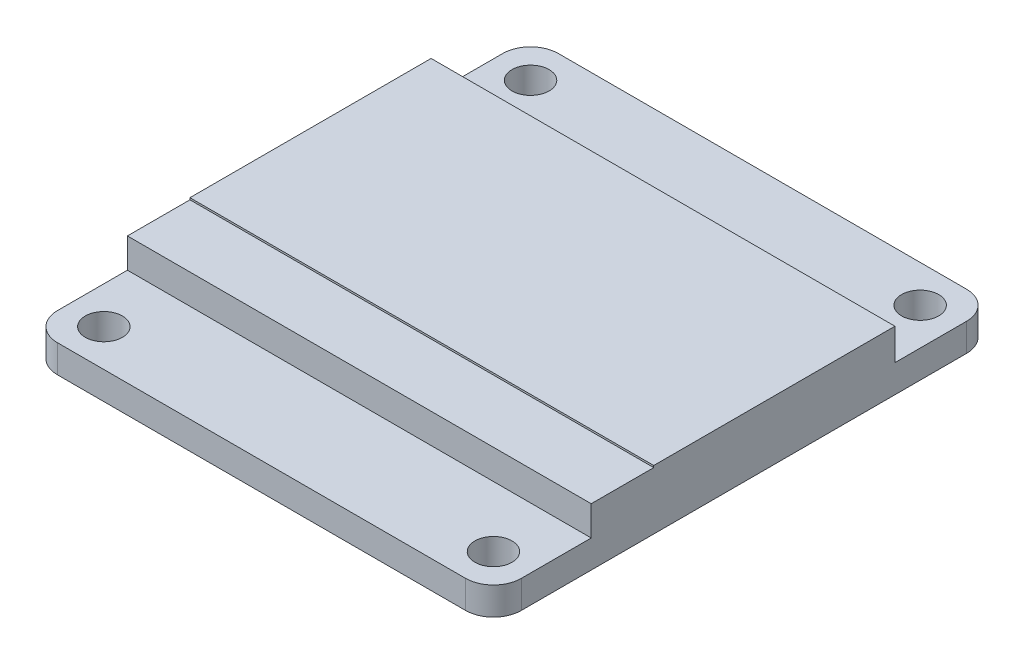
ISO-10303-21;
HEADER;
FILE_DESCRIPTION(('STEP AP214'),'2;1');
FILE_NAME('part.step','',(''),(''),'','','');
FILE_SCHEMA(('AUTOMOTIVE_DESIGN { 1 0 10303 214 1 1 1 1 }'));
ENDSEC;
DATA;
#1=APPLICATION_CONTEXT('core data for automotive mechanical design processes');
#2=APPLICATION_PROTOCOL_DEFINITION('international standard','automotive_design',2000,#1);
#3=PRODUCT_CONTEXT('',#1,'mechanical');
#4=PRODUCT('Part','Part','',(#3));
#5=PRODUCT_RELATED_PRODUCT_CATEGORY('part','',(#4));
#6=PRODUCT_DEFINITION_FORMATION('','',#4);
#7=PRODUCT_DEFINITION_CONTEXT('part definition',#1,'design');
#8=PRODUCT_DEFINITION('design','',#6,#7);
#9=PRODUCT_DEFINITION_SHAPE('','',#8);
#10=(LENGTH_UNIT() NAMED_UNIT(*) SI_UNIT(.MILLI.,.METRE.));
#11=(NAMED_UNIT(*) PLANE_ANGLE_UNIT() SI_UNIT($,.RADIAN.));
#12=(NAMED_UNIT(*) SI_UNIT($,.STERADIAN.) SOLID_ANGLE_UNIT());
#13=UNCERTAINTY_MEASURE_WITH_UNIT(LENGTH_MEASURE(1.E-05),#10,'distance_accuracy_value','');
#14=(GEOMETRIC_REPRESENTATION_CONTEXT(3) GLOBAL_UNCERTAINTY_ASSIGNED_CONTEXT((#13)) GLOBAL_UNIT_ASSIGNED_CONTEXT((#10,
#11,#12)) REPRESENTATION_CONTEXT('',''));
#15=CARTESIAN_POINT('',(0.,0.,0.));
#16=DIRECTION('',(0.,0.,1.));
#17=DIRECTION('',(1.,0.,0.));
#18=AXIS2_PLACEMENT_3D('',#15,#16,#17);
#19=CARTESIAN_POINT('',(-96.2574626865673,1.5,-90.8320895522388));
#20=DIRECTION('',(0.,-1.,0.));
#21=DIRECTION('',(0.,0.,-1.));
#22=AXIS2_PLACEMENT_3D('',#19,#20,#21);
#23=PLANE('',#22);
#24=CARTESIAN_POINT('',(-117.757462686567,1.5,-90.3320895522388));
#25=DIRECTION('',(0.,1.,0.));
#26=DIRECTION('',(0.,0.,1.));
#27=AXIS2_PLACEMENT_3D('',#24,#25,#26);
#28=CIRCLE('',#27,0.999999999999998);
#29=CARTESIAN_POINT('',(-117.757462686567,1.5,-89.3320895522388));
#30=VERTEX_POINT('',#29);
#31=EDGE_CURVE('E192',#30,#30,#28,.T.);
#32=ORIENTED_EDGE('',*,*,#31,.F.);
#33=EDGE_LOOP('',(#32));
#34=FACE_BOUND('',#33,.T.);
#35=CARTESIAN_POINT('',(-96.7574626865673,1.5,-90.3320895522388));
#36=DIRECTION('',(0.,1.,0.));
#37=DIRECTION('',(0.,0.,1.));
#38=AXIS2_PLACEMENT_3D('',#35,#36,#37);
#39=CIRCLE('',#38,0.999999999999998);
#40=CARTESIAN_POINT('',(-96.7574626865673,1.5,-89.3320895522388));
#41=VERTEX_POINT('',#40);
#42=EDGE_CURVE('E189',#41,#41,#39,.T.);
#43=ORIENTED_EDGE('',*,*,#42,.F.);
#44=EDGE_LOOP('',(#43));
#45=FACE_BOUND('',#44,.T.);
#46=DIRECTION('',(-1.,0.,0.));
#47=VECTOR('',#46,1.);
#48=CARTESIAN_POINT('',(-119.757462686567,1.5,-86.9720895522388));
#49=LINE('',#48,#47);
#50=CARTESIAN_POINT('',(-94.7574626865673,1.5,-86.9720895522388));
#51=VERTEX_POINT('',#50);
#52=CARTESIAN_POINT('',(-119.757462686567,1.5,-86.9720895522388));
#53=VERTEX_POINT('',#52);
#54=EDGE_CURVE('E62',#51,#53,#49,.T.);
#55=ORIENTED_EDGE('',*,*,#54,.F.);
#56=DIRECTION('',(0.,0.,-1.));
#57=VECTOR('',#56,1.);
#58=CARTESIAN_POINT('',(-94.7574626865673,1.5,-90.8320895522388));
#59=LINE('',#58,#57);
#60=CARTESIAN_POINT('',(-94.7574626865673,1.5,-90.8320895522388));
#61=VERTEX_POINT('',#60);
#62=EDGE_CURVE('E230',#51,#61,#59,.T.);
#63=ORIENTED_EDGE('',*,*,#62,.T.);
#64=CARTESIAN_POINT('',(-96.2574626865673,1.5,-90.8320895522388));
#65=DIRECTION('',(0.,1.,0.));
#66=DIRECTION('',(0.,0.,-1.));
#67=AXIS2_PLACEMENT_3D('',#64,#65,#66);
#68=CIRCLE('',#67,1.50000000000002);
#69=CARTESIAN_POINT('',(-96.2574626865673,1.5,-92.3320895522388));
#70=VERTEX_POINT('',#69);
#71=EDGE_CURVE('E213',#61,#70,#68,.T.);
#72=ORIENTED_EDGE('',*,*,#71,.T.);
#73=DIRECTION('',(-1.,0.,0.));
#74=VECTOR('',#73,1.);
#75=CARTESIAN_POINT('',(-118.257462686567,1.5,-92.3320895522388));
#76=LINE('',#75,#74);
#77=CARTESIAN_POINT('',(-118.257462686567,1.5,-92.3320895522388));
#78=VERTEX_POINT('',#77);
#79=EDGE_CURVE('E216',#70,#78,#76,.T.);
#80=ORIENTED_EDGE('',*,*,#79,.T.);
#81=CARTESIAN_POINT('',(-118.257462686567,1.5,-90.8320895522388));
#82=DIRECTION('',(0.,1.,0.));
#83=DIRECTION('',(0.,0.,1.));
#84=AXIS2_PLACEMENT_3D('',#81,#82,#83);
#85=CIRCLE('',#84,1.5);
#86=CARTESIAN_POINT('',(-119.757462686567,1.5,-90.8320895522388));
#87=VERTEX_POINT('',#86);
#88=EDGE_CURVE('E219',#78,#87,#85,.T.);
#89=ORIENTED_EDGE('',*,*,#88,.T.);
#90=DIRECTION('',(0.,0.,1.));
#91=VECTOR('',#90,1.);
#92=CARTESIAN_POINT('',(-119.757462686567,1.5,-90.8320895522388));
#93=LINE('',#92,#91);
#94=EDGE_CURVE('E222',#87,#53,#93,.T.);
#95=ORIENTED_EDGE('',*,*,#94,.T.);
#96=EDGE_LOOP('',(#55,#63,#72,#80,#89,#95));
#97=FACE_BOUND('',#96,.T.);
#98=ADVANCED_FACE('F39',(#34,#45,#97),#23,.F.);
#99=CARTESIAN_POINT('',(-96.7574626865673,1.5,-67.3320895522388));
#100=DIRECTION('',(0.,1.,0.));
#101=DIRECTION('',(0.,0.,1.));
#102=AXIS2_PLACEMENT_3D('',#99,#100,#101);
#103=CIRCLE('',#102,0.999999999999998);
#104=CARTESIAN_POINT('',(-96.7574626865673,1.5,-66.3320895522388));
#105=VERTEX_POINT('',#104);
#106=EDGE_CURVE('E196',#105,#105,#103,.T.);
#107=ORIENTED_EDGE('',*,*,#106,.F.);
#108=EDGE_LOOP('',(#107));
#109=FACE_BOUND('',#108,.T.);
#110=CARTESIAN_POINT('',(-117.757462686567,1.5,-67.3320895522388));
#111=DIRECTION('',(0.,1.,0.));
#112=DIRECTION('',(0.,0.,1.));
#113=AXIS2_PLACEMENT_3D('',#110,#111,#112);
#114=CIRCLE('',#113,0.999999999999998);
#115=CARTESIAN_POINT('',(-117.757462686567,1.5,-66.3320895522388));
#116=VERTEX_POINT('',#115);
#117=EDGE_CURVE('E202',#116,#116,#114,.T.);
#118=ORIENTED_EDGE('',*,*,#117,.F.);
#119=EDGE_LOOP('',(#118));
#120=FACE_BOUND('',#119,.T.);
#121=DIRECTION('',(1.,0.,0.));
#122=VECTOR('',#121,1.);
#123=CARTESIAN_POINT('',(-119.757462686567,1.5,-70.6020895522388));
#124=LINE('',#123,#122);
#125=CARTESIAN_POINT('',(-119.757462686567,1.5,-70.6020895522388));
#126=VERTEX_POINT('',#125);
#127=CARTESIAN_POINT('',(-94.7574626865673,1.5,-70.6020895522388));
#128=VERTEX_POINT('',#127);
#129=EDGE_CURVE('E164',#126,#128,#124,.T.);
#130=ORIENTED_EDGE('',*,*,#129,.F.);
#131=CARTESIAN_POINT('',(-119.757462686567,1.5,-66.8320895522388));
#132=VERTEX_POINT('',#131);
#133=EDGE_CURVE('E221',#126,#132,#93,.T.);
#134=ORIENTED_EDGE('',*,*,#133,.T.);
#135=CARTESIAN_POINT('',(-118.257462686567,1.5,-66.8320895522388));
#136=DIRECTION('',(0.,1.,0.));
#137=DIRECTION('',(0.,0.,1.));
#138=AXIS2_PLACEMENT_3D('',#135,#136,#137);
#139=CIRCLE('',#138,1.5);
#140=CARTESIAN_POINT('',(-118.257462686567,1.5,-65.3320895522388));
#141=VERTEX_POINT('',#140);
#142=EDGE_CURVE('E224',#132,#141,#139,.T.);
#143=ORIENTED_EDGE('',*,*,#142,.T.);
#144=DIRECTION('',(1.,0.,0.));
#145=VECTOR('',#144,1.);
#146=CARTESIAN_POINT('',(-118.257462686567,1.5,-65.3320895522388));
#147=LINE('',#146,#145);
#148=CARTESIAN_POINT('',(-96.2574626865673,1.5,-65.3320895522388));
#149=VERTEX_POINT('',#148);
#150=EDGE_CURVE('E226',#141,#149,#147,.T.);
#151=ORIENTED_EDGE('',*,*,#150,.T.);
#152=CARTESIAN_POINT('',(-96.2574626865673,1.5,-66.8320895522388));
#153=DIRECTION('',(0.,1.,0.));
#154=DIRECTION('',(0.,0.,1.));
#155=AXIS2_PLACEMENT_3D('',#152,#153,#154);
#156=CIRCLE('',#155,1.5);
#157=CARTESIAN_POINT('',(-94.7574626865673,1.5,-66.8320895522388));
#158=VERTEX_POINT('',#157);
#159=EDGE_CURVE('E228',#149,#158,#156,.T.);
#160=ORIENTED_EDGE('',*,*,#159,.T.);
#161=EDGE_CURVE('E231',#158,#128,#59,.T.);
#162=ORIENTED_EDGE('',*,*,#161,.T.);
#163=EDGE_LOOP('',(#130,#134,#143,#151,#160,#162));
#164=FACE_BOUND('',#163,.T.);
#165=ADVANCED_FACE('F288',(#109,#120,#164),#23,.F.);
#166=CARTESIAN_POINT('',(-96.2574626865673,1.5,-90.8320895522388));
#167=DIRECTION('',(0.,-1.,0.));
#168=DIRECTION('',(0.,0.,-1.));
#169=AXIS2_PLACEMENT_3D('',#166,#167,#168);
#170=CYLINDRICAL_SURFACE('',#169,1.50000000000002);
#171=CARTESIAN_POINT('',(-96.2574626865673,0.,-90.8320895522388));
#172=DIRECTION('',(0.,1.,0.));
#173=DIRECTION('',(0.,0.,-1.));
#174=AXIS2_PLACEMENT_3D('',#171,#172,#173);
#175=CIRCLE('',#174,1.50000000000002);
#176=CARTESIAN_POINT('',(-94.7574626865673,0.,-90.8320895522388));
#177=VERTEX_POINT('',#176);
#178=CARTESIAN_POINT('',(-96.2574626865673,0.,-92.3320895522388));
#179=VERTEX_POINT('',#178);
#180=EDGE_CURVE('E210',#177,#179,#175,.T.);
#181=ORIENTED_EDGE('',*,*,#180,.T.);
#182=DIRECTION('',(0.,-1.,0.));
#183=VECTOR('',#182,1.);
#184=CARTESIAN_POINT('',(-96.2574626865673,1.5,-92.3320895522388));
#185=LINE('',#184,#183);
#186=EDGE_CURVE('E11',#70,#179,#185,.T.);
#187=ORIENTED_EDGE('',*,*,#186,.F.);
#188=ORIENTED_EDGE('',*,*,#71,.F.);
#189=DIRECTION('',(0.,-1.,0.));
#190=VECTOR('',#189,1.);
#191=CARTESIAN_POINT('',(-94.7574626865673,1.5,-90.8320895522388));
#192=LINE('',#191,#190);
#193=EDGE_CURVE('E233',#61,#177,#192,.T.);
#194=ORIENTED_EDGE('',*,*,#193,.T.);
#195=EDGE_LOOP('',(#181,#187,#188,#194));
#196=FACE_BOUND('',#195,.T.);
#197=ADVANCED_FACE('F41',(#196),#170,.T.);
#198=CARTESIAN_POINT('',(-118.257462686567,1.5,-92.3320895522388));
#199=DIRECTION('',(0.,0.,1.));
#200=DIRECTION('',(1.,0.,0.));
#201=AXIS2_PLACEMENT_3D('',#198,#199,#200);
#202=PLANE('',#201);
#203=DIRECTION('',(-1.,0.,0.));
#204=VECTOR('',#203,1.);
#205=CARTESIAN_POINT('',(-118.257462686567,0.,-92.3320895522388));
#206=LINE('',#205,#204);
#207=CARTESIAN_POINT('',(-118.257462686567,0.,-92.3320895522388));
#208=VERTEX_POINT('',#207);
#209=EDGE_CURVE('E236',#179,#208,#206,.T.);
#210=ORIENTED_EDGE('',*,*,#209,.T.);
#211=DIRECTION('',(0.,-1.,0.));
#212=VECTOR('',#211,1.);
#213=CARTESIAN_POINT('',(-118.257462686567,1.5,-92.3320895522388));
#214=LINE('',#213,#212);
#215=EDGE_CURVE('E47',#78,#208,#214,.T.);
#216=ORIENTED_EDGE('',*,*,#215,.F.);
#217=ORIENTED_EDGE('',*,*,#79,.F.);
#218=ORIENTED_EDGE('',*,*,#186,.T.);
#219=EDGE_LOOP('',(#210,#216,#217,#218));
#220=FACE_BOUND('',#219,.T.);
#221=ADVANCED_FACE('F304',(#220),#202,.F.);
#222=CARTESIAN_POINT('',(-118.257462686567,1.5,-90.8320895522388));
#223=DIRECTION('',(0.,-1.,0.));
#224=DIRECTION('',(0.,0.,-1.));
#225=AXIS2_PLACEMENT_3D('',#222,#223,#224);
#226=CYLINDRICAL_SURFACE('',#225,1.5);
#227=CARTESIAN_POINT('',(-118.257462686567,0.,-90.8320895522388));
#228=DIRECTION('',(0.,1.,0.));
#229=DIRECTION('',(0.,0.,1.));
#230=AXIS2_PLACEMENT_3D('',#227,#228,#229);
#231=CIRCLE('',#230,1.5);
#232=CARTESIAN_POINT('',(-119.757462686567,0.,-90.8320895522388));
#233=VERTEX_POINT('',#232);
#234=EDGE_CURVE('E238',#208,#233,#231,.T.);
#235=ORIENTED_EDGE('',*,*,#234,.T.);
#236=DIRECTION('',(0.,-1.,0.));
#237=VECTOR('',#236,1.);
#238=CARTESIAN_POINT('',(-119.757462686567,1.5,-90.8320895522388));
#239=LINE('',#238,#237);
#240=EDGE_CURVE('E263',#87,#233,#239,.T.);
#241=ORIENTED_EDGE('',*,*,#240,.F.);
#242=ORIENTED_EDGE('',*,*,#88,.F.);
#243=ORIENTED_EDGE('',*,*,#215,.T.);
#244=EDGE_LOOP('',(#235,#241,#242,#243));
#245=FACE_BOUND('',#244,.T.);
#246=ADVANCED_FACE('F270',(#245),#226,.T.);
#247=CARTESIAN_POINT('',(-119.757462686567,1.5,-90.8320895522388));
#248=DIRECTION('',(1.,0.,0.));
#249=DIRECTION('',(0.,0.,-1.));
#250=AXIS2_PLACEMENT_3D('',#247,#248,#249);
#251=PLANE('',#250);
#252=DIRECTION('',(0.,0.,1.));
#253=VECTOR('',#252,1.);
#254=CARTESIAN_POINT('',(-119.757462686567,0.,-90.8320895522388));
#255=LINE('',#254,#253);
#256=CARTESIAN_POINT('',(-119.757462686567,0.,-66.8320895522388));
#257=VERTEX_POINT('',#256);
#258=EDGE_CURVE('E240',#233,#257,#255,.T.);
#259=ORIENTED_EDGE('',*,*,#258,.T.);
#260=DIRECTION('',(0.,-1.,0.));
#261=VECTOR('',#260,1.);
#262=CARTESIAN_POINT('',(-119.757462686567,1.5,-66.8320895522388));
#263=LINE('',#262,#261);
#264=EDGE_CURVE('E260',#132,#257,#263,.T.);
#265=ORIENTED_EDGE('',*,*,#264,.F.);
#266=ORIENTED_EDGE('',*,*,#133,.F.);
#267=DIRECTION('',(0.,-1.,0.));
#268=VECTOR('',#267,1.);
#269=CARTESIAN_POINT('',(-119.757462686567,3.1,-70.6020895522388));
#270=LINE('',#269,#268);
#271=CARTESIAN_POINT('',(-119.757462686567,3.1,-70.6020895522388));
#272=VERTEX_POINT('',#271);
#273=EDGE_CURVE('E185',#272,#126,#270,.T.);
#274=ORIENTED_EDGE('',*,*,#273,.F.);
#275=DIRECTION('',(0.,0.,1.));
#276=VECTOR('',#275,1.);
#277=CARTESIAN_POINT('',(-119.757462686567,3.1,-86.9720895522388));
#278=LINE('',#277,#276);
#279=CARTESIAN_POINT('',(-119.757462686567,3.1,-73.9720895522388));
#280=VERTEX_POINT('',#279);
#281=EDGE_CURVE('E163',#280,#272,#278,.T.);
#282=ORIENTED_EDGE('',*,*,#281,.F.);
#283=DIRECTION('',(0.,-1.,0.));
#284=VECTOR('',#283,1.);
#285=CARTESIAN_POINT('',(-119.757462686567,3.2,-73.9720895522388));
#286=LINE('',#285,#284);
#287=CARTESIAN_POINT('',(-119.757462686567,3.2,-73.9720895522388));
#288=VERTEX_POINT('',#287);
#289=EDGE_CURVE('E144',#288,#280,#286,.T.);
#290=ORIENTED_EDGE('',*,*,#289,.F.);
#291=DIRECTION('',(0.,0.,1.));
#292=VECTOR('',#291,1.);
#293=CARTESIAN_POINT('',(-119.757462686567,3.2,-86.9720895522388));
#294=LINE('',#293,#292);
#295=CARTESIAN_POINT('',(-119.757462686567,3.2,-86.9720895522388));
#296=VERTEX_POINT('',#295);
#297=EDGE_CURVE('E151',#296,#288,#294,.T.);
#298=ORIENTED_EDGE('',*,*,#297,.F.);
#299=DIRECTION('',(0.,-1.,0.));
#300=VECTOR('',#299,1.);
#301=CARTESIAN_POINT('',(-119.757462686567,3.1,-86.9720895522388));
#302=LINE('',#301,#300);
#303=EDGE_CURVE('E175',#296,#53,#302,.T.);
#304=ORIENTED_EDGE('',*,*,#303,.T.);
#305=ORIENTED_EDGE('',*,*,#94,.F.);
#306=ORIENTED_EDGE('',*,*,#240,.T.);
#307=EDGE_LOOP('',(#259,#265,#266,#274,#282,#290,#298,#304,#305,#306));
#308=FACE_BOUND('',#307,.T.);
#309=ADVANCED_FACE('F161',(#308),#251,.F.);
#310=CARTESIAN_POINT('',(-118.257462686567,1.5,-66.8320895522388));
#311=DIRECTION('',(0.,-1.,0.));
#312=DIRECTION('',(0.,0.,-1.));
#313=AXIS2_PLACEMENT_3D('',#310,#311,#312);
#314=CYLINDRICAL_SURFACE('',#313,1.5);
#315=CARTESIAN_POINT('',(-118.257462686567,0.,-66.8320895522388));
#316=DIRECTION('',(0.,1.,0.));
#317=DIRECTION('',(0.,0.,1.));
#318=AXIS2_PLACEMENT_3D('',#315,#316,#317);
#319=CIRCLE('',#318,1.5);
#320=CARTESIAN_POINT('',(-118.257462686567,0.,-65.3320895522388));
#321=VERTEX_POINT('',#320);
#322=EDGE_CURVE('E242',#257,#321,#319,.T.);
#323=ORIENTED_EDGE('',*,*,#322,.T.);
#324=DIRECTION('',(0.,-1.,0.));
#325=VECTOR('',#324,1.);
#326=CARTESIAN_POINT('',(-118.257462686567,1.5,-65.3320895522388));
#327=LINE('',#326,#325);
#328=EDGE_CURVE('E257',#141,#321,#327,.T.);
#329=ORIENTED_EDGE('',*,*,#328,.F.);
#330=ORIENTED_EDGE('',*,*,#142,.F.);
#331=ORIENTED_EDGE('',*,*,#264,.T.);
#332=EDGE_LOOP('',(#323,#329,#330,#331));
#333=FACE_BOUND('',#332,.T.);
#334=ADVANCED_FACE('F284',(#333),#314,.T.);
#335=CARTESIAN_POINT('',(-118.257462686567,1.5,-65.3320895522388));
#336=DIRECTION('',(0.,0.,-1.));
#337=DIRECTION('',(-1.,0.,0.));
#338=AXIS2_PLACEMENT_3D('',#335,#336,#337);
#339=PLANE('',#338);
#340=DIRECTION('',(1.,0.,0.));
#341=VECTOR('',#340,1.);
#342=CARTESIAN_POINT('',(-118.257462686567,0.,-65.3320895522388));
#343=LINE('',#342,#341);
#344=CARTESIAN_POINT('',(-96.2574626865673,0.,-65.3320895522388));
#345=VERTEX_POINT('',#344);
#346=EDGE_CURVE('E244',#321,#345,#343,.T.);
#347=ORIENTED_EDGE('',*,*,#346,.T.);
#348=DIRECTION('',(0.,-1.,0.));
#349=VECTOR('',#348,1.);
#350=CARTESIAN_POINT('',(-96.2574626865673,1.5,-65.3320895522388));
#351=LINE('',#350,#349);
#352=EDGE_CURVE('E254',#149,#345,#351,.T.);
#353=ORIENTED_EDGE('',*,*,#352,.F.);
#354=ORIENTED_EDGE('',*,*,#150,.F.);
#355=ORIENTED_EDGE('',*,*,#328,.T.);
#356=EDGE_LOOP('',(#347,#353,#354,#355));
#357=FACE_BOUND('',#356,.T.);
#358=ADVANCED_FACE('F315',(#357),#339,.F.);
#359=CARTESIAN_POINT('',(-96.2574626865673,1.5,-66.8320895522388));
#360=DIRECTION('',(0.,-1.,0.));
#361=DIRECTION('',(0.,0.,-1.));
#362=AXIS2_PLACEMENT_3D('',#359,#360,#361);
#363=CYLINDRICAL_SURFACE('',#362,1.5);
#364=CARTESIAN_POINT('',(-96.2574626865673,0.,-66.8320895522388));
#365=DIRECTION('',(0.,1.,0.));
#366=DIRECTION('',(0.,0.,1.));
#367=AXIS2_PLACEMENT_3D('',#364,#365,#366);
#368=CIRCLE('',#367,1.5);
#369=CARTESIAN_POINT('',(-94.7574626865673,0.,-66.8320895522388));
#370=VERTEX_POINT('',#369);
#371=EDGE_CURVE('E246',#345,#370,#368,.T.);
#372=ORIENTED_EDGE('',*,*,#371,.T.);
#373=DIRECTION('',(0.,-1.,0.));
#374=VECTOR('',#373,1.);
#375=CARTESIAN_POINT('',(-94.7574626865673,1.5,-66.8320895522388));
#376=LINE('',#375,#374);
#377=EDGE_CURVE('E251',#158,#370,#376,.T.);
#378=ORIENTED_EDGE('',*,*,#377,.F.);
#379=ORIENTED_EDGE('',*,*,#159,.F.);
#380=ORIENTED_EDGE('',*,*,#352,.T.);
#381=EDGE_LOOP('',(#372,#378,#379,#380));
#382=FACE_BOUND('',#381,.T.);
#383=ADVANCED_FACE('F313',(#382),#363,.T.);
#384=CARTESIAN_POINT('',(-94.7574626865673,1.5,-90.8320895522388));
#385=DIRECTION('',(-1.,0.,0.));
#386=DIRECTION('',(0.,0.,1.));
#387=AXIS2_PLACEMENT_3D('',#384,#385,#386);
#388=PLANE('',#387);
#389=DIRECTION('',(0.,0.,-1.));
#390=VECTOR('',#389,1.);
#391=CARTESIAN_POINT('',(-94.7574626865673,0.,-90.8320895522388));
#392=LINE('',#391,#390);
#393=EDGE_CURVE('E217',#370,#177,#392,.T.);
#394=ORIENTED_EDGE('',*,*,#393,.T.);
#395=ORIENTED_EDGE('',*,*,#193,.F.);
#396=ORIENTED_EDGE('',*,*,#62,.F.);
#397=DIRECTION('',(0.,-1.,0.));
#398=VECTOR('',#397,1.);
#399=CARTESIAN_POINT('',(-94.7574626865673,3.1,-86.9720895522388));
#400=LINE('',#399,#398);
#401=CARTESIAN_POINT('',(-94.7574626865673,3.2,-86.9720895522388));
#402=VERTEX_POINT('',#401);
#403=EDGE_CURVE('E179',#402,#51,#400,.T.);
#404=ORIENTED_EDGE('',*,*,#403,.F.);
#405=DIRECTION('',(0.,0.,-1.));
#406=VECTOR('',#405,1.);
#407=CARTESIAN_POINT('',(-94.7574626865673,3.2,-86.9720895522388));
#408=LINE('',#407,#406);
#409=CARTESIAN_POINT('',(-94.7574626865673,3.2,-73.9720895522388));
#410=VERTEX_POINT('',#409);
#411=EDGE_CURVE('E150',#410,#402,#408,.T.);
#412=ORIENTED_EDGE('',*,*,#411,.F.);
#413=DIRECTION('',(0.,-1.,0.));
#414=VECTOR('',#413,1.);
#415=CARTESIAN_POINT('',(-94.7574626865673,3.2,-73.9720895522388));
#416=LINE('',#415,#414);
#417=CARTESIAN_POINT('',(-94.7574626865673,3.1,-73.9720895522388));
#418=VERTEX_POINT('',#417);
#419=EDGE_CURVE('E146',#410,#418,#416,.T.);
#420=ORIENTED_EDGE('',*,*,#419,.T.);
#421=DIRECTION('',(0.,0.,-1.));
#422=VECTOR('',#421,1.);
#423=CARTESIAN_POINT('',(-94.7574626865673,3.1,-86.9720895522388));
#424=LINE('',#423,#422);
#425=CARTESIAN_POINT('',(-94.7574626865673,3.1,-70.6020895522388));
#426=VERTEX_POINT('',#425);
#427=EDGE_CURVE('E174',#426,#418,#424,.T.);
#428=ORIENTED_EDGE('',*,*,#427,.F.);
#429=DIRECTION('',(0.,-1.,0.));
#430=VECTOR('',#429,1.);
#431=CARTESIAN_POINT('',(-94.7574626865673,3.1,-70.6020895522388));
#432=LINE('',#431,#430);
#433=EDGE_CURVE('E182',#426,#128,#432,.T.);
#434=ORIENTED_EDGE('',*,*,#433,.T.);
#435=ORIENTED_EDGE('',*,*,#161,.F.);
#436=ORIENTED_EDGE('',*,*,#377,.T.);
#437=EDGE_LOOP('',(#394,#395,#396,#404,#412,#420,#428,#434,#435,#436));
#438=FACE_BOUND('',#437,.T.);
#439=ADVANCED_FACE('F297',(#438),#388,.F.);
#440=CARTESIAN_POINT('',(-96.2574626865673,0.,-90.8320895522388));
#441=DIRECTION('',(0.,-1.,0.));
#442=DIRECTION('',(0.,0.,-1.));
#443=AXIS2_PLACEMENT_3D('',#440,#441,#442);
#444=PLANE('',#443);
#445=CARTESIAN_POINT('',(-117.757462686567,0.,-67.3320895522388));
#446=DIRECTION('',(0.,1.,0.));
#447=DIRECTION('',(0.,0.,1.));
#448=AXIS2_PLACEMENT_3D('',#445,#446,#447);
#449=CIRCLE('',#448,0.999999999999998);
#450=CARTESIAN_POINT('',(-117.757462686567,0.,-66.3320895522388));
#451=VERTEX_POINT('',#450);
#452=EDGE_CURVE('E188',#451,#451,#449,.T.);
#453=ORIENTED_EDGE('',*,*,#452,.T.);
#454=EDGE_LOOP('',(#453));
#455=FACE_BOUND('',#454,.T.);
#456=CARTESIAN_POINT('',(-96.7574626865673,0.,-67.3320895522388));
#457=DIRECTION('',(0.,1.,0.));
#458=DIRECTION('',(0.,0.,1.));
#459=AXIS2_PLACEMENT_3D('',#456,#457,#458);
#460=CIRCLE('',#459,0.999999999999998);
#461=CARTESIAN_POINT('',(-96.7574626865673,0.,-66.3320895522388));
#462=VERTEX_POINT('',#461);
#463=EDGE_CURVE('E199',#462,#462,#460,.T.);
#464=ORIENTED_EDGE('',*,*,#463,.T.);
#465=EDGE_LOOP('',(#464));
#466=FACE_BOUND('',#465,.T.);
#467=CARTESIAN_POINT('',(-96.7574626865673,0.,-90.3320895522388));
#468=DIRECTION('',(0.,1.,0.));
#469=DIRECTION('',(0.,0.,1.));
#470=AXIS2_PLACEMENT_3D('',#467,#468,#469);
#471=CIRCLE('',#470,0.999999999999998);
#472=CARTESIAN_POINT('',(-96.7574626865673,0.,-89.3320895522388));
#473=VERTEX_POINT('',#472);
#474=EDGE_CURVE('E193',#473,#473,#471,.T.);
#475=ORIENTED_EDGE('',*,*,#474,.T.);
#476=EDGE_LOOP('',(#475));
#477=FACE_BOUND('',#476,.T.);
#478=CARTESIAN_POINT('',(-117.757462686567,0.,-90.3320895522388));
#479=DIRECTION('',(0.,1.,0.));
#480=DIRECTION('',(0.,0.,1.));
#481=AXIS2_PLACEMENT_3D('',#478,#479,#480);
#482=CIRCLE('',#481,0.999999999999998);
#483=CARTESIAN_POINT('',(-117.757462686567,0.,-89.3320895522388));
#484=VERTEX_POINT('',#483);
#485=EDGE_CURVE('E207',#484,#484,#482,.T.);
#486=ORIENTED_EDGE('',*,*,#485,.T.);
#487=EDGE_LOOP('',(#486));
#488=FACE_BOUND('',#487,.T.);
#489=ORIENTED_EDGE('',*,*,#180,.F.);
#490=ORIENTED_EDGE('',*,*,#393,.F.);
#491=ORIENTED_EDGE('',*,*,#371,.F.);
#492=ORIENTED_EDGE('',*,*,#346,.F.);
#493=ORIENTED_EDGE('',*,*,#322,.F.);
#494=ORIENTED_EDGE('',*,*,#258,.F.);
#495=ORIENTED_EDGE('',*,*,#234,.F.);
#496=ORIENTED_EDGE('',*,*,#209,.F.);
#497=EDGE_LOOP('',(#489,#490,#491,#492,#493,#494,#495,#496));
#498=FACE_BOUND('',#497,.T.);
#499=ADVANCED_FACE('F276',(#455,#466,#477,#488,#498),#444,.T.);
#500=CARTESIAN_POINT('',(-117.757462686567,0.,-90.3320895522388));
#501=DIRECTION('',(0.,1.,0.));
#502=DIRECTION('',(0.,0.,1.));
#503=AXIS2_PLACEMENT_3D('',#500,#501,#502);
#504=CYLINDRICAL_SURFACE('',#503,0.999999999999998);
#505=ORIENTED_EDGE('',*,*,#485,.F.);
#506=EDGE_LOOP('',(#505));
#507=FACE_BOUND('',#506,.T.);
#508=ORIENTED_EDGE('',*,*,#31,.T.);
#509=EDGE_LOOP('',(#508));
#510=FACE_BOUND('',#509,.T.);
#511=ADVANCED_FACE('F335',(#507,#510),#504,.F.);
#512=CARTESIAN_POINT('',(-96.7574626865673,0.,-90.3320895522388));
#513=DIRECTION('',(0.,1.,0.));
#514=DIRECTION('',(0.,0.,1.));
#515=AXIS2_PLACEMENT_3D('',#512,#513,#514);
#516=CYLINDRICAL_SURFACE('',#515,0.999999999999998);
#517=ORIENTED_EDGE('',*,*,#474,.F.);
#518=EDGE_LOOP('',(#517));
#519=FACE_BOUND('',#518,.T.);
#520=ORIENTED_EDGE('',*,*,#42,.T.);
#521=EDGE_LOOP('',(#520));
#522=FACE_BOUND('',#521,.T.);
#523=ADVANCED_FACE('F357',(#519,#522),#516,.F.);
#524=CARTESIAN_POINT('',(-96.7574626865673,0.,-67.3320895522388));
#525=DIRECTION('',(0.,1.,0.));
#526=DIRECTION('',(0.,0.,1.));
#527=AXIS2_PLACEMENT_3D('',#524,#525,#526);
#528=CYLINDRICAL_SURFACE('',#527,0.999999999999998);
#529=ORIENTED_EDGE('',*,*,#463,.F.);
#530=EDGE_LOOP('',(#529));
#531=FACE_BOUND('',#530,.T.);
#532=ORIENTED_EDGE('',*,*,#106,.T.);
#533=EDGE_LOOP('',(#532));
#534=FACE_BOUND('',#533,.T.);
#535=ADVANCED_FACE('F364',(#531,#534),#528,.F.);
#536=CARTESIAN_POINT('',(-117.757462686567,0.,-67.3320895522388));
#537=DIRECTION('',(0.,1.,0.));
#538=DIRECTION('',(0.,0.,1.));
#539=AXIS2_PLACEMENT_3D('',#536,#537,#538);
#540=CYLINDRICAL_SURFACE('',#539,0.999999999999998);
#541=ORIENTED_EDGE('',*,*,#452,.F.);
#542=EDGE_LOOP('',(#541));
#543=FACE_BOUND('',#542,.T.);
#544=ORIENTED_EDGE('',*,*,#117,.T.);
#545=EDGE_LOOP('',(#544));
#546=FACE_BOUND('',#545,.T.);
#547=ADVANCED_FACE('F372',(#543,#546),#540,.F.);
#548=CARTESIAN_POINT('',(-119.757462686567,3.1,-70.6020895522388));
#549=DIRECTION('',(0.,0.,-1.));
#550=DIRECTION('',(-1.,0.,0.));
#551=AXIS2_PLACEMENT_3D('',#548,#549,#550);
#552=PLANE('',#551);
#553=ORIENTED_EDGE('',*,*,#129,.T.);
#554=ORIENTED_EDGE('',*,*,#433,.F.);
#555=DIRECTION('',(1.,0.,0.));
#556=VECTOR('',#555,1.);
#557=CARTESIAN_POINT('',(-119.757462686567,3.1,-70.6020895522388));
#558=LINE('',#557,#556);
#559=EDGE_CURVE('E172',#272,#426,#558,.T.);
#560=ORIENTED_EDGE('',*,*,#559,.F.);
#561=ORIENTED_EDGE('',*,*,#273,.T.);
#562=EDGE_LOOP('',(#553,#554,#560,#561));
#563=FACE_BOUND('',#562,.T.);
#564=ADVANCED_FACE('F292',(#563),#552,.F.);
#565=CARTESIAN_POINT('',(-119.757462686567,3.1,-86.9720895522388));
#566=DIRECTION('',(0.,0.,1.));
#567=DIRECTION('',(1.,0.,0.));
#568=AXIS2_PLACEMENT_3D('',#565,#566,#567);
#569=PLANE('',#568);
#570=ORIENTED_EDGE('',*,*,#54,.T.);
#571=ORIENTED_EDGE('',*,*,#303,.F.);
#572=DIRECTION('',(-1.,0.,0.));
#573=VECTOR('',#572,1.);
#574=CARTESIAN_POINT('',(-119.757462686567,3.2,-86.9720895522388));
#575=LINE('',#574,#573);
#576=EDGE_CURVE('E157',#402,#296,#575,.T.);
#577=ORIENTED_EDGE('',*,*,#576,.F.);
#578=ORIENTED_EDGE('',*,*,#403,.T.);
#579=EDGE_LOOP('',(#570,#571,#577,#578));
#580=FACE_BOUND('',#579,.T.);
#581=ADVANCED_FACE('F301',(#580),#569,.F.);
#582=CARTESIAN_POINT('',(0.,3.1,0.));
#583=DIRECTION('',(0.,1.,0.));
#584=DIRECTION('',(0.,0.,1.));
#585=AXIS2_PLACEMENT_3D('',#582,#583,#584);
#586=PLANE('',#585);
#587=DIRECTION('',(1.,0.,0.));
#588=VECTOR('',#587,1.);
#589=CARTESIAN_POINT('',(-119.757462686567,3.1,-73.9720895522388));
#590=LINE('',#589,#588);
#591=EDGE_CURVE('E54',#280,#418,#590,.T.);
#592=ORIENTED_EDGE('',*,*,#591,.F.);
#593=ORIENTED_EDGE('',*,*,#281,.T.);
#594=ORIENTED_EDGE('',*,*,#559,.T.);
#595=ORIENTED_EDGE('',*,*,#427,.T.);
#596=EDGE_LOOP('',(#592,#593,#594,#595));
#597=FACE_BOUND('',#596,.T.);
#598=ADVANCED_FACE('F295',(#597),#586,.T.);
#599=CARTESIAN_POINT('',(-119.757462686567,3.2,-73.9720895522388));
#600=DIRECTION('',(0.,0.,-1.));
#601=DIRECTION('',(-1.,0.,0.));
#602=AXIS2_PLACEMENT_3D('',#599,#600,#601);
#603=PLANE('',#602);
#604=ORIENTED_EDGE('',*,*,#591,.T.);
#605=ORIENTED_EDGE('',*,*,#419,.F.);
#606=DIRECTION('',(1.,0.,0.));
#607=VECTOR('',#606,1.);
#608=CARTESIAN_POINT('',(-119.757462686567,3.2,-73.9720895522388));
#609=LINE('',#608,#607);
#610=EDGE_CURVE('E140',#288,#410,#609,.T.);
#611=ORIENTED_EDGE('',*,*,#610,.F.);
#612=ORIENTED_EDGE('',*,*,#289,.T.);
#613=EDGE_LOOP('',(#604,#605,#611,#612));
#614=FACE_BOUND('',#613,.T.);
#615=ADVANCED_FACE('F142',(#614),#603,.F.);
#616=CARTESIAN_POINT('',(0.,3.2,0.));
#617=DIRECTION('',(0.,1.,0.));
#618=DIRECTION('',(0.,0.,1.));
#619=AXIS2_PLACEMENT_3D('',#616,#617,#618);
#620=PLANE('',#619);
#621=ORIENTED_EDGE('',*,*,#297,.T.);
#622=ORIENTED_EDGE('',*,*,#610,.T.);
#623=ORIENTED_EDGE('',*,*,#411,.T.);
#624=ORIENTED_EDGE('',*,*,#576,.T.);
#625=EDGE_LOOP('',(#621,#622,#623,#624));
#626=FACE_BOUND('',#625,.T.);
#627=ADVANCED_FACE('F155',(#626),#620,.T.);
#628=CLOSED_SHELL('',(#98,#165,#197,#221,#246,#309,#334,#358,#383,#439,#499,#511,#523,#535,#547,
#564,#581,#598,#615,#627));
#629=MANIFOLD_SOLID_BREP('B2',#628);
#630=ADVANCED_BREP_SHAPE_REPRESENTATION('',(#18,#629),#14);
#631=SHAPE_DEFINITION_REPRESENTATION(#9,#630);
ENDSEC;
END-ISO-10303-21;
